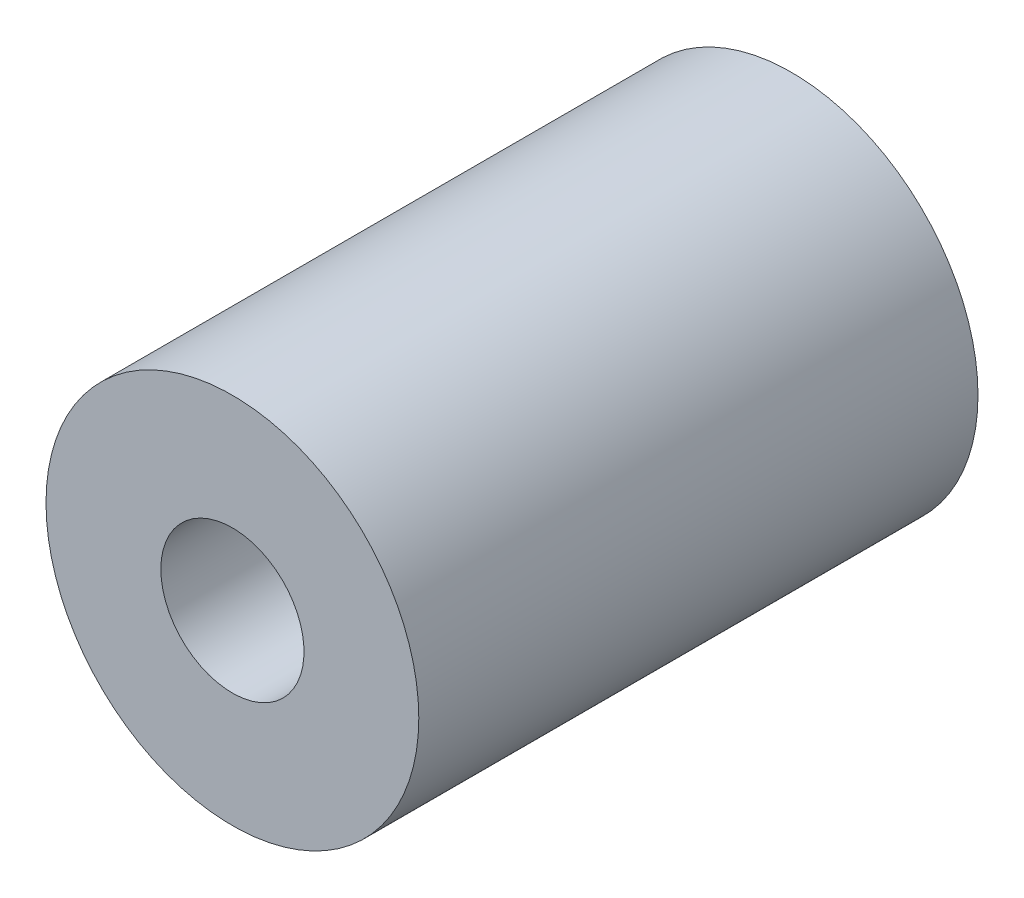
ISO-10303-21;
HEADER;
FILE_DESCRIPTION(('STEP AP214'),'2;1');
FILE_NAME('part.step','',(''),(''),'','','');
FILE_SCHEMA(('AUTOMOTIVE_DESIGN { 1 0 10303 214 1 1 1 1 }'));
ENDSEC;
DATA;
#1=APPLICATION_CONTEXT('core data for automotive mechanical design processes');
#2=APPLICATION_PROTOCOL_DEFINITION('international standard','automotive_design',2000,#1);
#3=PRODUCT_CONTEXT('',#1,'mechanical');
#4=PRODUCT('Part','Part','',(#3));
#5=PRODUCT_RELATED_PRODUCT_CATEGORY('part','',(#4));
#6=PRODUCT_DEFINITION_FORMATION('','',#4);
#7=PRODUCT_DEFINITION_CONTEXT('part definition',#1,'design');
#8=PRODUCT_DEFINITION('design','',#6,#7);
#9=PRODUCT_DEFINITION_SHAPE('','',#8);
#10=(LENGTH_UNIT() NAMED_UNIT(*) SI_UNIT(.MILLI.,.METRE.));
#11=(NAMED_UNIT(*) PLANE_ANGLE_UNIT() SI_UNIT($,.RADIAN.));
#12=(NAMED_UNIT(*) SI_UNIT($,.STERADIAN.) SOLID_ANGLE_UNIT());
#13=UNCERTAINTY_MEASURE_WITH_UNIT(LENGTH_MEASURE(1.E-05),#10,'distance_accuracy_value','');
#14=(GEOMETRIC_REPRESENTATION_CONTEXT(3) GLOBAL_UNCERTAINTY_ASSIGNED_CONTEXT((#13)) GLOBAL_UNIT_ASSIGNED_CONTEXT((#10,
#11,#12)) REPRESENTATION_CONTEXT('',''));
#15=CARTESIAN_POINT('',(0.,0.,0.));
#16=DIRECTION('',(0.,0.,1.));
#17=DIRECTION('',(1.,0.,0.));
#18=AXIS2_PLACEMENT_3D('',#15,#16,#17);
#19=CARTESIAN_POINT('',(0.,0.,9.525));
#20=DIRECTION('',(0.,0.,1.));
#21=DIRECTION('',(1.,0.,0.));
#22=AXIS2_PLACEMENT_3D('',#19,#20,#21);
#23=PLANE('',#22);
#24=CARTESIAN_POINT('',(0.,0.,9.525));
#25=DIRECTION('',(0.,0.,1.));
#26=DIRECTION('',(1.,0.,0.));
#27=AXIS2_PLACEMENT_3D('',#24,#25,#26);
#28=CIRCLE('',#27,6.35);
#29=CARTESIAN_POINT('',(-6.35,0.,9.525));
#30=VERTEX_POINT('',#29);
#31=EDGE_CURVE('E10',#30,#30,#28,.T.);
#32=ORIENTED_EDGE('',*,*,#31,.T.);
#33=EDGE_LOOP('',(#32));
#34=FACE_BOUND('',#33,.T.);
#35=CARTESIAN_POINT('',(0.,0.,9.525));
#36=DIRECTION('',(0.,0.,1.));
#37=DIRECTION('',(1.,0.,0.));
#38=AXIS2_PLACEMENT_3D('',#35,#36,#37);
#39=CIRCLE('',#38,2.4384);
#40=CARTESIAN_POINT('',(-2.4384,0.,9.525));
#41=VERTEX_POINT('',#40);
#42=EDGE_CURVE('E40',#41,#41,#39,.T.);
#43=ORIENTED_EDGE('',*,*,#42,.F.);
#44=EDGE_LOOP('',(#43));
#45=FACE_BOUND('',#44,.T.);
#46=ADVANCED_FACE('F29',(#34,#45),#23,.T.);
#47=CARTESIAN_POINT('',(0.,0.,-9.525));
#48=DIRECTION('',(0.,0.,1.));
#49=DIRECTION('',(1.,0.,0.));
#50=AXIS2_PLACEMENT_3D('',#47,#48,#49);
#51=PLANE('',#50);
#52=CARTESIAN_POINT('',(0.,0.,-9.525));
#53=DIRECTION('',(0.,0.,1.));
#54=DIRECTION('',(1.,0.,0.));
#55=AXIS2_PLACEMENT_3D('',#52,#53,#54);
#56=CIRCLE('',#55,6.35);
#57=CARTESIAN_POINT('',(-6.35,0.,-9.525));
#58=VERTEX_POINT('',#57);
#59=EDGE_CURVE('E33',#58,#58,#56,.T.);
#60=ORIENTED_EDGE('',*,*,#59,.F.);
#61=EDGE_LOOP('',(#60));
#62=FACE_BOUND('',#61,.T.);
#63=CARTESIAN_POINT('',(0.,0.,-9.525));
#64=DIRECTION('',(0.,0.,1.));
#65=DIRECTION('',(1.,0.,0.));
#66=AXIS2_PLACEMENT_3D('',#63,#64,#65);
#67=CIRCLE('',#66,2.4384);
#68=CARTESIAN_POINT('',(-2.4384,0.,-9.525));
#69=VERTEX_POINT('',#68);
#70=EDGE_CURVE('E42',#69,#69,#67,.T.);
#71=ORIENTED_EDGE('',*,*,#70,.T.);
#72=EDGE_LOOP('',(#71));
#73=FACE_BOUND('',#72,.T.);
#74=ADVANCED_FACE('F52',(#62,#73),#51,.F.);
#75=CARTESIAN_POINT('',(0.,0.,9.525));
#76=DIRECTION('',(0.,0.,-1.));
#77=DIRECTION('',(-1.,0.,0.));
#78=AXIS2_PLACEMENT_3D('',#75,#76,#77);
#79=CYLINDRICAL_SURFACE('',#78,6.35);
#80=CARTESIAN_POINT('',(-6.35,0.,9.525));
#81=CARTESIAN_POINT('',(-6.35,0.,9.3265625));
#82=CARTESIAN_POINT('',(-6.35,0.,9.128125));
#83=CARTESIAN_POINT('',(-6.35,0.,8.73125));
#84=CARTESIAN_POINT('',(-6.35,0.,8.5328125));
#85=CARTESIAN_POINT('',(-6.35,0.,8.1359375));
#86=CARTESIAN_POINT('',(-6.35,0.,7.9375));
#87=CARTESIAN_POINT('',(-6.35,0.,7.540625));
#88=CARTESIAN_POINT('',(-6.35,0.,7.3421875));
#89=CARTESIAN_POINT('',(-6.35,0.,6.9453125));
#90=CARTESIAN_POINT('',(-6.35,0.,6.746875));
#91=CARTESIAN_POINT('',(-6.35,0.,6.35));
#92=CARTESIAN_POINT('',(-6.35,0.,6.1515625));
#93=CARTESIAN_POINT('',(-6.35,0.,5.7546875));
#94=CARTESIAN_POINT('',(-6.35,0.,5.55625));
#95=CARTESIAN_POINT('',(-6.35,0.,5.159375));
#96=CARTESIAN_POINT('',(-6.35,0.,4.9609375));
#97=CARTESIAN_POINT('',(-6.35,0.,4.5640625));
#98=CARTESIAN_POINT('',(-6.35,0.,4.365625));
#99=CARTESIAN_POINT('',(-6.35,0.,3.96875));
#100=CARTESIAN_POINT('',(-6.35,0.,3.7703125));
#101=CARTESIAN_POINT('',(-6.35,0.,3.3734375));
#102=CARTESIAN_POINT('',(-6.35,0.,3.175));
#103=CARTESIAN_POINT('',(-6.35,0.,2.778125));
#104=CARTESIAN_POINT('',(-6.35,0.,2.5796875));
#105=CARTESIAN_POINT('',(-6.35,0.,2.1828125));
#106=CARTESIAN_POINT('',(-6.35,0.,1.984375));
#107=CARTESIAN_POINT('',(-6.35,0.,1.5875));
#108=CARTESIAN_POINT('',(-6.35,0.,1.3890625));
#109=CARTESIAN_POINT('',(-6.35,0.,0.992187500000001));
#110=CARTESIAN_POINT('',(-6.35,0.,0.793750000000001));
#111=CARTESIAN_POINT('',(-6.35,0.,0.396875));
#112=CARTESIAN_POINT('',(-6.35,0.,0.1984375));
#113=CARTESIAN_POINT('',(-6.35,0.,-0.1984375));
#114=CARTESIAN_POINT('',(-6.35,0.,-0.396875));
#115=CARTESIAN_POINT('',(-6.35,0.,-0.793750000000001));
#116=CARTESIAN_POINT('',(-6.35,0.,-0.992187500000001));
#117=CARTESIAN_POINT('',(-6.35,0.,-1.3890625));
#118=CARTESIAN_POINT('',(-6.35,0.,-1.5875));
#119=CARTESIAN_POINT('',(-6.35,0.,-1.984375));
#120=CARTESIAN_POINT('',(-6.35,0.,-2.1828125));
#121=CARTESIAN_POINT('',(-6.35,0.,-2.5796875));
#122=CARTESIAN_POINT('',(-6.35,0.,-2.778125));
#123=CARTESIAN_POINT('',(-6.35,0.,-3.175));
#124=CARTESIAN_POINT('',(-6.35,0.,-3.3734375));
#125=CARTESIAN_POINT('',(-6.35,0.,-3.7703125));
#126=CARTESIAN_POINT('',(-6.35,0.,-3.96875));
#127=CARTESIAN_POINT('',(-6.35,0.,-4.365625));
#128=CARTESIAN_POINT('',(-6.35,0.,-4.5640625));
#129=CARTESIAN_POINT('',(-6.35,0.,-4.9609375));
#130=CARTESIAN_POINT('',(-6.35,0.,-5.159375));
#131=CARTESIAN_POINT('',(-6.35,0.,-5.55625));
#132=CARTESIAN_POINT('',(-6.35,0.,-5.7546875));
#133=CARTESIAN_POINT('',(-6.35,0.,-6.1515625));
#134=CARTESIAN_POINT('',(-6.35,0.,-6.35));
#135=CARTESIAN_POINT('',(-6.35,0.,-6.746875));
#136=CARTESIAN_POINT('',(-6.35,0.,-6.9453125));
#137=CARTESIAN_POINT('',(-6.35,0.,-7.3421875));
#138=CARTESIAN_POINT('',(-6.35,0.,-7.540625));
#139=CARTESIAN_POINT('',(-6.35,0.,-7.9375));
#140=CARTESIAN_POINT('',(-6.35,0.,-8.1359375));
#141=CARTESIAN_POINT('',(-6.35,0.,-8.5328125));
#142=CARTESIAN_POINT('',(-6.35,0.,-8.73125));
#143=CARTESIAN_POINT('',(-6.35,0.,-9.128125));
#144=CARTESIAN_POINT('',(-6.35,0.,-9.3265625));
#145=CARTESIAN_POINT('',(-6.35,0.,-9.525));
#146=B_SPLINE_CURVE_WITH_KNOTS('',3,(#80,#81,#82,#83,#84,#85,#86,#87,#88,#89,#90,#91,#92,#93,
#94,#95,#96,#97,#98,#99,#100,#101,#102,#103,#104,#105,#106,#107,#108,#109,#110,#111,#112,#113,
#114,#115,#116,#117,#118,#119,#120,#121,#122,#123,#124,#125,#126,#127,#128,#129,#130,#131,#132,
#133,#134,#135,#136,#137,#138,#139,#140,#141,#142,#143,#144,#145),.UNSPECIFIED.,.F.,.F.,(4,2,2,
2,2,2,2,2,2,2,2,2,2,2,2,2,2,2,2,2,2,2,2,2,2,2,2,2,2,2,2,2,4),(0.,0.5953125,1.190625,1.7859375,
2.38125,2.9765625,3.571875,4.1671875,4.7625,5.3578125,5.953125,6.5484375,7.14375,7.7390625,
8.334375,8.9296875,9.525,10.1203125,10.715625,11.3109375,11.90625,12.5015625,13.096875,
13.6921875,14.2875,14.8828125,15.478125,16.0734375,16.66875,17.2640625,17.859375,18.4546875,
19.05),.UNSPECIFIED.);
#147=EDGE_CURVE('BSEAM31',#30,#58,#146,.T.);
#148=ORIENTED_EDGE('',*,*,#31,.F.);
#149=ORIENTED_EDGE('',*,*,#59,.T.);
#150=ORIENTED_EDGE('',*,*,#147,.T.);
#151=ORIENTED_EDGE('',*,*,#147,.F.);
#152=EDGE_LOOP('',(#148,#150,#149,#151));
#153=FACE_BOUND('',#152,.T.);
#154=ADVANCED_FACE('F31',(#153),#79,.T.);
#155=CARTESIAN_POINT('',(0.,0.,9.525));
#156=DIRECTION('',(0.,0.,-1.));
#157=DIRECTION('',(-1.,0.,0.));
#158=AXIS2_PLACEMENT_3D('',#155,#156,#157);
#159=CYLINDRICAL_SURFACE('',#158,2.4384);
#160=CARTESIAN_POINT('',(-2.4384,0.,9.525));
#161=CARTESIAN_POINT('',(-2.4384,0.,9.3265625));
#162=CARTESIAN_POINT('',(-2.4384,0.,9.128125));
#163=CARTESIAN_POINT('',(-2.4384,0.,8.73125));
#164=CARTESIAN_POINT('',(-2.4384,0.,8.5328125));
#165=CARTESIAN_POINT('',(-2.4384,0.,8.1359375));
#166=CARTESIAN_POINT('',(-2.4384,0.,7.9375));
#167=CARTESIAN_POINT('',(-2.4384,0.,7.540625));
#168=CARTESIAN_POINT('',(-2.4384,0.,7.3421875));
#169=CARTESIAN_POINT('',(-2.4384,0.,6.9453125));
#170=CARTESIAN_POINT('',(-2.4384,0.,6.746875));
#171=CARTESIAN_POINT('',(-2.4384,0.,6.35));
#172=CARTESIAN_POINT('',(-2.4384,0.,6.1515625));
#173=CARTESIAN_POINT('',(-2.4384,0.,5.7546875));
#174=CARTESIAN_POINT('',(-2.4384,0.,5.55625));
#175=CARTESIAN_POINT('',(-2.4384,0.,5.159375));
#176=CARTESIAN_POINT('',(-2.4384,0.,4.9609375));
#177=CARTESIAN_POINT('',(-2.4384,0.,4.5640625));
#178=CARTESIAN_POINT('',(-2.4384,0.,4.365625));
#179=CARTESIAN_POINT('',(-2.4384,0.,3.96875));
#180=CARTESIAN_POINT('',(-2.4384,0.,3.7703125));
#181=CARTESIAN_POINT('',(-2.4384,0.,3.3734375));
#182=CARTESIAN_POINT('',(-2.4384,0.,3.175));
#183=CARTESIAN_POINT('',(-2.4384,0.,2.778125));
#184=CARTESIAN_POINT('',(-2.4384,0.,2.5796875));
#185=CARTESIAN_POINT('',(-2.4384,0.,2.1828125));
#186=CARTESIAN_POINT('',(-2.4384,0.,1.984375));
#187=CARTESIAN_POINT('',(-2.4384,0.,1.5875));
#188=CARTESIAN_POINT('',(-2.4384,0.,1.3890625));
#189=CARTESIAN_POINT('',(-2.4384,0.,0.992187499999999));
#190=CARTESIAN_POINT('',(-2.4384,0.,0.793749999999999));
#191=CARTESIAN_POINT('',(-2.4384,0.,0.396874999999998));
#192=CARTESIAN_POINT('',(-2.4384,0.,0.198437499999998));
#193=CARTESIAN_POINT('',(-2.4384,0.,-0.198437500000002));
#194=CARTESIAN_POINT('',(-2.4384,0.,-0.396875000000002));
#195=CARTESIAN_POINT('',(-2.4384,0.,-0.793750000000002));
#196=CARTESIAN_POINT('',(-2.4384,0.,-0.992187500000002));
#197=CARTESIAN_POINT('',(-2.4384,0.,-1.3890625));
#198=CARTESIAN_POINT('',(-2.4384,0.,-1.5875));
#199=CARTESIAN_POINT('',(-2.4384,0.,-1.984375));
#200=CARTESIAN_POINT('',(-2.4384,0.,-2.1828125));
#201=CARTESIAN_POINT('',(-2.4384,0.,-2.5796875));
#202=CARTESIAN_POINT('',(-2.4384,0.,-2.778125));
#203=CARTESIAN_POINT('',(-2.4384,0.,-3.175));
#204=CARTESIAN_POINT('',(-2.4384,0.,-3.3734375));
#205=CARTESIAN_POINT('',(-2.4384,0.,-3.7703125));
#206=CARTESIAN_POINT('',(-2.4384,0.,-3.96875));
#207=CARTESIAN_POINT('',(-2.4384,0.,-4.365625));
#208=CARTESIAN_POINT('',(-2.4384,0.,-4.5640625));
#209=CARTESIAN_POINT('',(-2.4384,0.,-4.9609375));
#210=CARTESIAN_POINT('',(-2.4384,0.,-5.159375));
#211=CARTESIAN_POINT('',(-2.4384,0.,-5.55625));
#212=CARTESIAN_POINT('',(-2.4384,0.,-5.7546875));
#213=CARTESIAN_POINT('',(-2.4384,0.,-6.1515625));
#214=CARTESIAN_POINT('',(-2.4384,0.,-6.35));
#215=CARTESIAN_POINT('',(-2.4384,0.,-6.746875));
#216=CARTESIAN_POINT('',(-2.4384,0.,-6.9453125));
#217=CARTESIAN_POINT('',(-2.4384,0.,-7.3421875));
#218=CARTESIAN_POINT('',(-2.4384,0.,-7.540625));
#219=CARTESIAN_POINT('',(-2.4384,0.,-7.9375));
#220=CARTESIAN_POINT('',(-2.4384,0.,-8.1359375));
#221=CARTESIAN_POINT('',(-2.4384,0.,-8.5328125));
#222=CARTESIAN_POINT('',(-2.4384,0.,-8.73125));
#223=CARTESIAN_POINT('',(-2.4384,0.,-9.128125));
#224=CARTESIAN_POINT('',(-2.4384,0.,-9.3265625));
#225=CARTESIAN_POINT('',(-2.4384,0.,-9.525));
#226=B_SPLINE_CURVE_WITH_KNOTS('',3,(#160,#161,#162,#163,#164,#165,#166,#167,#168,#169,#170,
#171,#172,#173,#174,#175,#176,#177,#178,#179,#180,#181,#182,#183,#184,#185,#186,#187,#188,#189,
#190,#191,#192,#193,#194,#195,#196,#197,#198,#199,#200,#201,#202,#203,#204,#205,#206,#207,#208,
#209,#210,#211,#212,#213,#214,#215,#216,#217,#218,#219,#220,#221,#222,#223,#224,#225),
.UNSPECIFIED.,.F.,.F.,(4,2,2,2,2,2,2,2,2,2,2,2,2,2,2,2,2,2,2,2,2,2,2,2,2,2,2,2,2,2,2,2,4),(0.,
0.595312499999999,1.190625,1.7859375,2.38125,2.9765625,3.571875,4.1671875,4.7625,5.3578125,
5.953125,6.5484375,7.14375,7.7390625,8.334375,8.9296875,9.525,10.1203125,10.715625,11.3109375,
11.90625,12.5015625,13.096875,13.6921875,14.2875,14.8828125,15.478125,16.0734375,16.66875,
17.2640625,17.859375,18.4546875,19.05),.UNSPECIFIED.);
#227=EDGE_CURVE('BSEAM48',#41,#69,#226,.T.);
#228=ORIENTED_EDGE('',*,*,#42,.T.);
#229=ORIENTED_EDGE('',*,*,#70,.F.);
#230=ORIENTED_EDGE('',*,*,#227,.T.);
#231=ORIENTED_EDGE('',*,*,#227,.F.);
#232=EDGE_LOOP('',(#228,#230,#229,#231));
#233=FACE_BOUND('',#232,.T.);
#234=ADVANCED_FACE('F48',(#233),#159,.F.);
#235=CLOSED_SHELL('',(#46,#74,#154,#234));
#236=MANIFOLD_SOLID_BREP('B2',#235);
#237=ADVANCED_BREP_SHAPE_REPRESENTATION('',(#18,#236),#14);
#238=SHAPE_DEFINITION_REPRESENTATION(#9,#237);
ENDSEC;
END-ISO-10303-21;
